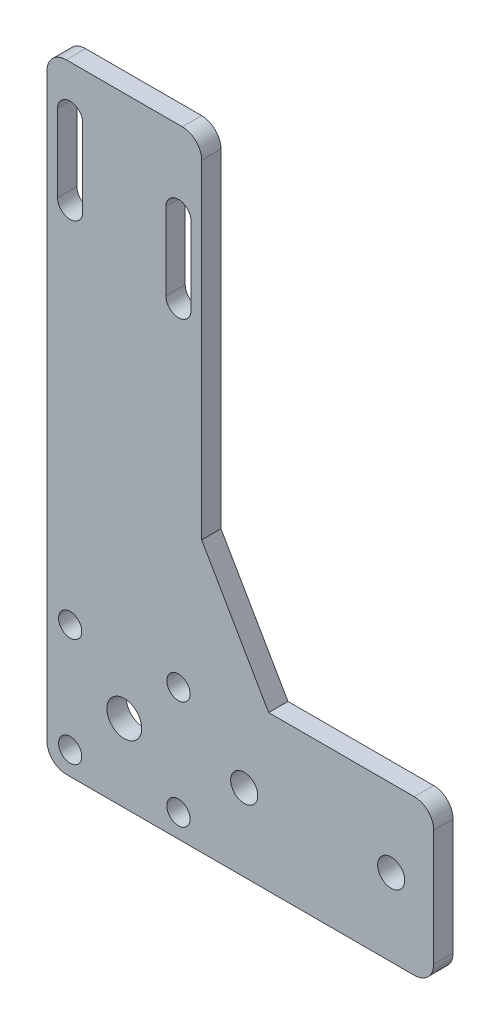
ISO-10303-21;
HEADER;
FILE_DESCRIPTION(('STEP AP214'),'2;1');
FILE_NAME('part.step','',(''),(''),'','','');
FILE_SCHEMA(('AUTOMOTIVE_DESIGN { 1 0 10303 214 1 1 1 1 }'));
ENDSEC;
DATA;
#1=APPLICATION_CONTEXT('core data for automotive mechanical design processes');
#2=APPLICATION_PROTOCOL_DEFINITION('international standard','automotive_design',2000,#1);
#3=PRODUCT_CONTEXT('',#1,'mechanical');
#4=PRODUCT('Part','Part','',(#3));
#5=PRODUCT_RELATED_PRODUCT_CATEGORY('part','',(#4));
#6=PRODUCT_DEFINITION_FORMATION('','',#4);
#7=PRODUCT_DEFINITION_CONTEXT('part definition',#1,'design');
#8=PRODUCT_DEFINITION('design','',#6,#7);
#9=PRODUCT_DEFINITION_SHAPE('','',#8);
#10=(LENGTH_UNIT() NAMED_UNIT(*) SI_UNIT(.MILLI.,.METRE.));
#11=(NAMED_UNIT(*) PLANE_ANGLE_UNIT() SI_UNIT($,.RADIAN.));
#12=(NAMED_UNIT(*) SI_UNIT($,.STERADIAN.) SOLID_ANGLE_UNIT());
#13=UNCERTAINTY_MEASURE_WITH_UNIT(LENGTH_MEASURE(1.E-05),#10,'distance_accuracy_value','');
#14=(GEOMETRIC_REPRESENTATION_CONTEXT(3) GLOBAL_UNCERTAINTY_ASSIGNED_CONTEXT((#13)) GLOBAL_UNIT_ASSIGNED_CONTEXT((#10,
#11,#12)) REPRESENTATION_CONTEXT('',''));
#15=CARTESIAN_POINT('',(0.,0.,0.));
#16=DIRECTION('',(0.,0.,1.));
#17=DIRECTION('',(1.,0.,0.));
#18=AXIS2_PLACEMENT_3D('',#15,#16,#17);
#19=CARTESIAN_POINT('',(40.,0.,5.));
#20=DIRECTION('',(-1.,0.,0.));
#21=DIRECTION('',(0.,0.,1.));
#22=AXIS2_PLACEMENT_3D('',#19,#20,#21);
#23=PLANE('',#22);
#24=DIRECTION('',(0.,1.,0.));
#25=VECTOR('',#24,1.);
#26=CARTESIAN_POINT('',(40.,0.,5.));
#27=LINE('',#26,#25);
#28=CARTESIAN_POINT('',(40.,69.9999999999998,5.));
#29=VERTEX_POINT('',#28);
#30=CARTESIAN_POINT('',(40.,155.,5.));
#31=VERTEX_POINT('',#30);
#32=EDGE_CURVE('E268',#29,#31,#27,.T.);
#33=ORIENTED_EDGE('',*,*,#32,.F.);
#34=DIRECTION('',(0.,0.,-1.));
#35=VECTOR('',#34,1.);
#36=CARTESIAN_POINT('',(40.,69.9999999999998,5.));
#37=LINE('',#36,#35);
#38=CARTESIAN_POINT('',(40.,69.9999999999998,0.));
#39=VERTEX_POINT('',#38);
#40=EDGE_CURVE('E54',#29,#39,#37,.T.);
#41=ORIENTED_EDGE('',*,*,#40,.T.);
#42=DIRECTION('',(0.,1.,0.));
#43=VECTOR('',#42,1.);
#44=CARTESIAN_POINT('',(40.,0.,0.));
#45=LINE('',#44,#43);
#46=CARTESIAN_POINT('',(40.,155.,0.));
#47=VERTEX_POINT('',#46);
#48=EDGE_CURVE('E279',#39,#47,#45,.T.);
#49=ORIENTED_EDGE('',*,*,#48,.T.);
#50=DIRECTION('',(0.,0.,-1.));
#51=VECTOR('',#50,1.);
#52=CARTESIAN_POINT('',(40.,155.,5.));
#53=LINE('',#52,#51);
#54=EDGE_CURVE('E340',#47,#31,#53,.F.);
#55=ORIENTED_EDGE('',*,*,#54,.T.);
#56=EDGE_LOOP('',(#33,#41,#49,#55));
#57=FACE_BOUND('',#56,.T.);
#58=ADVANCED_FACE('F33',(#57),#23,.F.);
#59=CARTESIAN_POINT('',(0.,0.,5.));
#60=DIRECTION('',(1.,0.,0.));
#61=DIRECTION('',(0.,0.,-1.));
#62=AXIS2_PLACEMENT_3D('',#59,#60,#61);
#63=PLANE('',#62);
#64=DIRECTION('',(0.,-1.,0.));
#65=VECTOR('',#64,1.);
#66=CARTESIAN_POINT('',(0.,0.,5.));
#67=LINE('',#66,#65);
#68=CARTESIAN_POINT('',(0.,155.,5.));
#69=VERTEX_POINT('',#68);
#70=CARTESIAN_POINT('',(0.,5.,5.));
#71=VERTEX_POINT('',#70);
#72=EDGE_CURVE('E261',#69,#71,#67,.T.);
#73=ORIENTED_EDGE('',*,*,#72,.F.);
#74=DIRECTION('',(0.,0.,-1.));
#75=VECTOR('',#74,1.);
#76=CARTESIAN_POINT('',(0.,155.,5.));
#77=LINE('',#76,#75);
#78=CARTESIAN_POINT('',(0.,155.,0.));
#79=VERTEX_POINT('',#78);
#80=EDGE_CURVE('E332',#69,#79,#77,.T.);
#81=ORIENTED_EDGE('',*,*,#80,.T.);
#82=DIRECTION('',(0.,-1.,0.));
#83=VECTOR('',#82,1.);
#84=CARTESIAN_POINT('',(0.,0.,0.));
#85=LINE('',#84,#83);
#86=CARTESIAN_POINT('',(0.,5.,0.));
#87=VERTEX_POINT('',#86);
#88=EDGE_CURVE('E260',#79,#87,#85,.T.);
#89=ORIENTED_EDGE('',*,*,#88,.T.);
#90=DIRECTION('',(0.,0.,-1.));
#91=VECTOR('',#90,1.);
#92=CARTESIAN_POINT('',(0.,5.,5.));
#93=LINE('',#92,#91);
#94=EDGE_CURVE('E330',#87,#71,#93,.F.);
#95=ORIENTED_EDGE('',*,*,#94,.T.);
#96=EDGE_LOOP('',(#73,#81,#89,#95));
#97=FACE_BOUND('',#96,.T.);
#98=ADVANCED_FACE('F407',(#97),#63,.F.);
#99=CARTESIAN_POINT('',(0.,0.,5.));
#100=DIRECTION('',(0.,1.,0.));
#101=DIRECTION('',(0.,0.,1.));
#102=AXIS2_PLACEMENT_3D('',#99,#100,#101);
#103=PLANE('',#102);
#104=DIRECTION('',(1.,0.,0.));
#105=VECTOR('',#104,1.);
#106=CARTESIAN_POINT('',(0.,0.,0.));
#107=LINE('',#106,#105);
#108=CARTESIAN_POINT('',(5.,0.,0.));
#109=VERTEX_POINT('',#108);
#110=CARTESIAN_POINT('',(95.,0.,0.));
#111=VERTEX_POINT('',#110);
#112=EDGE_CURVE('E276',#109,#111,#107,.T.);
#113=ORIENTED_EDGE('',*,*,#112,.T.);
#114=DIRECTION('',(0.,0.,1.));
#115=VECTOR('',#114,1.);
#116=CARTESIAN_POINT('',(95.,0.,5.));
#117=LINE('',#116,#115);
#118=CARTESIAN_POINT('',(95.,0.,5.));
#119=VERTEX_POINT('',#118);
#120=EDGE_CURVE('E327',#111,#119,#117,.T.);
#121=ORIENTED_EDGE('',*,*,#120,.T.);
#122=DIRECTION('',(1.,0.,0.));
#123=VECTOR('',#122,1.);
#124=CARTESIAN_POINT('',(0.,0.,5.));
#125=LINE('',#124,#123);
#126=CARTESIAN_POINT('',(5.,0.,5.));
#127=VERTEX_POINT('',#126);
#128=EDGE_CURVE('E264',#127,#119,#125,.T.);
#129=ORIENTED_EDGE('',*,*,#128,.F.);
#130=DIRECTION('',(0.,0.,-1.));
#131=VECTOR('',#130,1.);
#132=CARTESIAN_POINT('',(5.,0.,5.));
#133=LINE('',#132,#131);
#134=EDGE_CURVE('E324',#127,#109,#133,.T.);
#135=ORIENTED_EDGE('',*,*,#134,.T.);
#136=EDGE_LOOP('',(#113,#121,#129,#135));
#137=FACE_BOUND('',#136,.T.);
#138=ADVANCED_FACE('F412',(#137),#103,.F.);
#139=CARTESIAN_POINT('',(0.,160.,5.));
#140=DIRECTION('',(0.,-1.,0.));
#141=DIRECTION('',(0.,0.,-1.));
#142=AXIS2_PLACEMENT_3D('',#139,#140,#141);
#143=PLANE('',#142);
#144=DIRECTION('',(-1.,0.,0.));
#145=VECTOR('',#144,1.);
#146=CARTESIAN_POINT('',(0.,160.,0.));
#147=LINE('',#146,#145);
#148=CARTESIAN_POINT('',(35.,160.,0.));
#149=VERTEX_POINT('',#148);
#150=CARTESIAN_POINT('',(5.,160.,0.));
#151=VERTEX_POINT('',#150);
#152=EDGE_CURVE('E265',#149,#151,#147,.T.);
#153=ORIENTED_EDGE('',*,*,#152,.T.);
#154=DIRECTION('',(0.,0.,-1.));
#155=VECTOR('',#154,1.);
#156=CARTESIAN_POINT('',(5.,160.,5.));
#157=LINE('',#156,#155);
#158=CARTESIAN_POINT('',(5.,160.,5.));
#159=VERTEX_POINT('',#158);
#160=EDGE_CURVE('E338',#151,#159,#157,.F.);
#161=ORIENTED_EDGE('',*,*,#160,.T.);
#162=DIRECTION('',(-1.,0.,0.));
#163=VECTOR('',#162,1.);
#164=CARTESIAN_POINT('',(0.,160.,5.));
#165=LINE('',#164,#163);
#166=CARTESIAN_POINT('',(35.,160.,5.));
#167=VERTEX_POINT('',#166);
#168=EDGE_CURVE('E270',#167,#159,#165,.T.);
#169=ORIENTED_EDGE('',*,*,#168,.F.);
#170=DIRECTION('',(0.,0.,-1.));
#171=VECTOR('',#170,1.);
#172=CARTESIAN_POINT('',(35.,160.,5.));
#173=LINE('',#172,#171);
#174=EDGE_CURVE('E335',#167,#149,#173,.T.);
#175=ORIENTED_EDGE('',*,*,#174,.T.);
#176=EDGE_LOOP('',(#153,#161,#169,#175));
#177=FACE_BOUND('',#176,.T.);
#178=ADVANCED_FACE('F390',(#177),#143,.F.);
#179=CARTESIAN_POINT('',(0.,0.,5.));
#180=DIRECTION('',(0.,0.,-1.));
#181=DIRECTION('',(-1.,0.,0.));
#182=AXIS2_PLACEMENT_3D('',#179,#180,#181);
#183=PLANE('',#182);
#184=DIRECTION('',(0.,1.,0.));
#185=VECTOR('',#184,1.);
#186=CARTESIAN_POINT('',(37.25,120.,5.));
#187=LINE('',#186,#185);
#188=CARTESIAN_POINT('',(37.25,120.,5.));
#189=VERTEX_POINT('',#188);
#190=CARTESIAN_POINT('',(37.25,140.,5.));
#191=VERTEX_POINT('',#190);
#192=EDGE_CURVE('E289',#189,#191,#187,.T.);
#193=ORIENTED_EDGE('',*,*,#192,.F.);
#194=CARTESIAN_POINT('',(34.,120.,5.));
#195=DIRECTION('',(0.,0.,1.));
#196=DIRECTION('',(1.,0.,0.));
#197=AXIS2_PLACEMENT_3D('',#194,#195,#196);
#198=CIRCLE('',#197,3.25);
#199=CARTESIAN_POINT('',(30.75,120.,5.));
#200=VERTEX_POINT('',#199);
#201=EDGE_CURVE('E257',#200,#189,#198,.T.);
#202=ORIENTED_EDGE('',*,*,#201,.F.);
#203=DIRECTION('',(0.,-1.,0.));
#204=VECTOR('',#203,1.);
#205=CARTESIAN_POINT('',(30.75,120.,5.));
#206=LINE('',#205,#204);
#207=CARTESIAN_POINT('',(30.75,140.,5.));
#208=VERTEX_POINT('',#207);
#209=EDGE_CURVE('E293',#208,#200,#206,.T.);
#210=ORIENTED_EDGE('',*,*,#209,.F.);
#211=CARTESIAN_POINT('',(34.,140.,5.));
#212=DIRECTION('',(0.,0.,1.));
#213=DIRECTION('',(1.,0.,0.));
#214=AXIS2_PLACEMENT_3D('',#211,#212,#213);
#215=CIRCLE('',#214,3.25);
#216=EDGE_CURVE('E291',#191,#208,#215,.T.);
#217=ORIENTED_EDGE('',*,*,#216,.F.);
#218=EDGE_LOOP('',(#193,#202,#210,#217));
#219=FACE_BOUND('',#218,.T.);
#220=DIRECTION('',(0.,-1.,0.));
#221=VECTOR('',#220,1.);
#222=CARTESIAN_POINT('',(2.74999999999998,148.,5.));
#223=LINE('',#222,#221);
#224=CARTESIAN_POINT('',(2.74999999999998,148.,5.));
#225=VERTEX_POINT('',#224);
#226=CARTESIAN_POINT('',(2.74999999999998,128.,5.));
#227=VERTEX_POINT('',#226);
#228=EDGE_CURVE('E252',#225,#227,#223,.T.);
#229=ORIENTED_EDGE('',*,*,#228,.F.);
#230=CARTESIAN_POINT('',(5.99999999999998,148.,5.));
#231=DIRECTION('',(0.,0.,1.));
#232=DIRECTION('',(1.,0.,0.));
#233=AXIS2_PLACEMENT_3D('',#230,#231,#232);
#234=CIRCLE('',#233,3.25);
#235=CARTESIAN_POINT('',(9.24999999999998,148.,5.));
#236=VERTEX_POINT('',#235);
#237=EDGE_CURVE('E176',#236,#225,#234,.T.);
#238=ORIENTED_EDGE('',*,*,#237,.F.);
#239=DIRECTION('',(0.,1.,0.));
#240=VECTOR('',#239,1.);
#241=CARTESIAN_POINT('',(9.24999999999998,148.,5.));
#242=LINE('',#241,#240);
#243=CARTESIAN_POINT('',(9.24999999999999,128.,5.));
#244=VERTEX_POINT('',#243);
#245=EDGE_CURVE('E286',#244,#236,#242,.T.);
#246=ORIENTED_EDGE('',*,*,#245,.F.);
#247=CARTESIAN_POINT('',(5.99999999999999,128.,5.));
#248=DIRECTION('',(0.,0.,1.));
#249=DIRECTION('',(1.,0.,0.));
#250=AXIS2_PLACEMENT_3D('',#247,#248,#249);
#251=CIRCLE('',#250,3.25);
#252=EDGE_CURVE('E284',#227,#244,#251,.T.);
#253=ORIENTED_EDGE('',*,*,#252,.F.);
#254=EDGE_LOOP('',(#229,#238,#246,#253));
#255=FACE_BOUND('',#254,.T.);
#256=CARTESIAN_POINT('',(6.,34.,5.));
#257=DIRECTION('',(0.,0.,-1.));
#258=DIRECTION('',(-1.,0.,0.));
#259=AXIS2_PLACEMENT_3D('',#256,#257,#258);
#260=CIRCLE('',#259,3.);
#261=CARTESIAN_POINT('',(3.,34.,5.));
#262=VERTEX_POINT('',#261);
#263=EDGE_CURVE('E249',#262,#262,#260,.T.);
#264=ORIENTED_EDGE('',*,*,#263,.T.);
#265=EDGE_LOOP('',(#264));
#266=FACE_BOUND('',#265,.T.);
#267=CARTESIAN_POINT('',(34.,34.,5.));
#268=DIRECTION('',(0.,0.,-1.));
#269=DIRECTION('',(-1.,0.,0.));
#270=AXIS2_PLACEMENT_3D('',#267,#268,#269);
#271=CIRCLE('',#270,3.);
#272=CARTESIAN_POINT('',(31.,34.,5.));
#273=VERTEX_POINT('',#272);
#274=EDGE_CURVE('E246',#273,#273,#271,.T.);
#275=ORIENTED_EDGE('',*,*,#274,.T.);
#276=EDGE_LOOP('',(#275));
#277=FACE_BOUND('',#276,.T.);
#278=CARTESIAN_POINT('',(34.,6.00000000000001,5.));
#279=DIRECTION('',(0.,0.,-1.));
#280=DIRECTION('',(-1.,0.,0.));
#281=AXIS2_PLACEMENT_3D('',#278,#279,#280);
#282=CIRCLE('',#281,3.);
#283=CARTESIAN_POINT('',(31.,6.00000000000001,5.));
#284=VERTEX_POINT('',#283);
#285=EDGE_CURVE('E243',#284,#284,#282,.T.);
#286=ORIENTED_EDGE('',*,*,#285,.T.);
#287=EDGE_LOOP('',(#286));
#288=FACE_BOUND('',#287,.T.);
#289=CARTESIAN_POINT('',(6.,6.00000000000001,5.));
#290=DIRECTION('',(0.,0.,-1.));
#291=DIRECTION('',(-1.,0.,0.));
#292=AXIS2_PLACEMENT_3D('',#289,#290,#291);
#293=CIRCLE('',#292,3.);
#294=CARTESIAN_POINT('',(3.,6.00000000000001,5.));
#295=VERTEX_POINT('',#294);
#296=EDGE_CURVE('E234',#295,#295,#293,.T.);
#297=ORIENTED_EDGE('',*,*,#296,.T.);
#298=EDGE_LOOP('',(#297));
#299=FACE_BOUND('',#298,.T.);
#300=CARTESIAN_POINT('',(20.,20.,5.));
#301=DIRECTION('',(0.,0.,-1.));
#302=DIRECTION('',(-1.,0.,0.));
#303=AXIS2_PLACEMENT_3D('',#300,#301,#302);
#304=CIRCLE('',#303,4.5);
#305=CARTESIAN_POINT('',(15.5,20.,5.));
#306=VERTEX_POINT('',#305);
#307=EDGE_CURVE('E256',#306,#306,#304,.T.);
#308=ORIENTED_EDGE('',*,*,#307,.T.);
#309=EDGE_LOOP('',(#308));
#310=FACE_BOUND('',#309,.T.);
#311=DIRECTION('',(0.,1.,0.));
#312=VECTOR('',#311,1.);
#313=CARTESIAN_POINT('',(100.,0.,5.));
#314=LINE('',#313,#312);
#315=CARTESIAN_POINT('',(100.,5.,5.));
#316=VERTEX_POINT('',#315);
#317=CARTESIAN_POINT('',(100.,35.,5.));
#318=VERTEX_POINT('',#317);
#319=EDGE_CURVE('E360',#316,#318,#314,.T.);
#320=ORIENTED_EDGE('',*,*,#319,.T.);
#321=CARTESIAN_POINT('',(95.,35.,5.));
#322=DIRECTION('',(0.,0.,-1.));
#323=DIRECTION('',(-1.,0.,0.));
#324=AXIS2_PLACEMENT_3D('',#321,#322,#323);
#325=CIRCLE('',#324,5.);
#326=CARTESIAN_POINT('',(95.,40.,5.));
#327=VERTEX_POINT('',#326);
#328=EDGE_CURVE('E309',#318,#327,#325,.F.);
#329=ORIENTED_EDGE('',*,*,#328,.T.);
#330=DIRECTION('',(-1.,0.,0.));
#331=VECTOR('',#330,1.);
#332=CARTESIAN_POINT('',(40.,40.,5.));
#333=LINE('',#332,#331);
#334=CARTESIAN_POINT('',(57.3205080756888,40.,5.));
#335=VERTEX_POINT('',#334);
#336=EDGE_CURVE('E351',#327,#335,#333,.T.);
#337=ORIENTED_EDGE('',*,*,#336,.T.);
#338=DIRECTION('',(-0.500000000000004,0.866025403784436,0.));
#339=VECTOR('',#338,1.);
#340=CARTESIAN_POINT('',(60.3108891324553,34.8205080756891,5.));
#341=LINE('',#340,#339);
#342=EDGE_CURVE('E41',#335,#29,#341,.T.);
#343=ORIENTED_EDGE('',*,*,#342,.T.);
#344=ORIENTED_EDGE('',*,*,#32,.T.);
#345=CARTESIAN_POINT('',(35.,155.,5.));
#346=DIRECTION('',(0.,0.,-1.));
#347=DIRECTION('',(-1.,0.,0.));
#348=AXIS2_PLACEMENT_3D('',#345,#346,#347);
#349=CIRCLE('',#348,5.);
#350=EDGE_CURVE('E303',#31,#167,#349,.F.);
#351=ORIENTED_EDGE('',*,*,#350,.T.);
#352=ORIENTED_EDGE('',*,*,#168,.T.);
#353=CARTESIAN_POINT('',(5.,155.,5.));
#354=DIRECTION('',(0.,0.,-1.));
#355=DIRECTION('',(-1.,0.,0.));
#356=AXIS2_PLACEMENT_3D('',#353,#354,#355);
#357=CIRCLE('',#356,5.);
#358=EDGE_CURVE('E305',#159,#69,#357,.F.);
#359=ORIENTED_EDGE('',*,*,#358,.T.);
#360=ORIENTED_EDGE('',*,*,#72,.T.);
#361=CARTESIAN_POINT('',(5.,5.,5.));
#362=DIRECTION('',(0.,0.,-1.));
#363=DIRECTION('',(-1.,0.,0.));
#364=AXIS2_PLACEMENT_3D('',#361,#362,#363);
#365=CIRCLE('',#364,5.);
#366=EDGE_CURVE('E301',#71,#127,#365,.F.);
#367=ORIENTED_EDGE('',*,*,#366,.T.);
#368=ORIENTED_EDGE('',*,*,#128,.T.);
#369=CARTESIAN_POINT('',(95.,5.,5.));
#370=DIRECTION('',(0.,0.,-1.));
#371=DIRECTION('',(-1.,0.,0.));
#372=AXIS2_PLACEMENT_3D('',#369,#370,#371);
#373=CIRCLE('',#372,5.);
#374=EDGE_CURVE('E307',#119,#316,#373,.F.);
#375=ORIENTED_EDGE('',*,*,#374,.T.);
#376=EDGE_LOOP('',(#320,#329,#337,#343,#344,#351,#352,#359,#360,#367,#368,#375));
#377=FACE_BOUND('',#376,.T.);
#378=CARTESIAN_POINT('',(89.,20.,5.));
#379=DIRECTION('',(0.,0.,1.));
#380=DIRECTION('',(-1.,0.,0.));
#381=AXIS2_PLACEMENT_3D('',#378,#379,#380);
#382=CIRCLE('',#381,3.50000000000001);
#383=CARTESIAN_POINT('',(85.5,20.,5.));
#384=VERTEX_POINT('',#383);
#385=EDGE_CURVE('E373',#384,#384,#382,.T.);
#386=ORIENTED_EDGE('',*,*,#385,.F.);
#387=EDGE_LOOP('',(#386));
#388=FACE_BOUND('',#387,.T.);
#389=CARTESIAN_POINT('',(51.,20.,5.));
#390=DIRECTION('',(0.,0.,1.));
#391=DIRECTION('',(1.,0.,0.));
#392=AXIS2_PLACEMENT_3D('',#389,#390,#391);
#393=CIRCLE('',#392,3.5);
#394=CARTESIAN_POINT('',(54.5,20.,5.));
#395=VERTEX_POINT('',#394);
#396=EDGE_CURVE('E367',#395,#395,#393,.T.);
#397=ORIENTED_EDGE('',*,*,#396,.F.);
#398=EDGE_LOOP('',(#397));
#399=FACE_BOUND('',#398,.T.);
#400=ADVANCED_FACE('F357',(#219,#255,#266,#277,#288,#299,#310,#377,#388,#399),#183,.F.);
#401=CARTESIAN_POINT('',(0.,0.,0.));
#402=DIRECTION('',(0.,0.,-1.));
#403=DIRECTION('',(-1.,0.,0.));
#404=AXIS2_PLACEMENT_3D('',#401,#402,#403);
#405=PLANE('',#404);
#406=CARTESIAN_POINT('',(34.,120.,0.));
#407=DIRECTION('',(0.,0.,1.));
#408=DIRECTION('',(1.,0.,0.));
#409=AXIS2_PLACEMENT_3D('',#406,#407,#408);
#410=CIRCLE('',#409,3.25);
#411=CARTESIAN_POINT('',(30.75,120.,0.));
#412=VERTEX_POINT('',#411);
#413=CARTESIAN_POINT('',(37.25,120.,0.));
#414=VERTEX_POINT('',#413);
#415=EDGE_CURVE('E211',#412,#414,#410,.T.);
#416=ORIENTED_EDGE('',*,*,#415,.T.);
#417=DIRECTION('',(0.,1.,0.));
#418=VECTOR('',#417,1.);
#419=CARTESIAN_POINT('',(37.25,120.,0.));
#420=LINE('',#419,#418);
#421=CARTESIAN_POINT('',(37.25,140.,0.));
#422=VERTEX_POINT('',#421);
#423=EDGE_CURVE('E214',#414,#422,#420,.T.);
#424=ORIENTED_EDGE('',*,*,#423,.T.);
#425=CARTESIAN_POINT('',(34.,140.,0.));
#426=DIRECTION('',(0.,0.,1.));
#427=DIRECTION('',(1.,0.,0.));
#428=AXIS2_PLACEMENT_3D('',#425,#426,#427);
#429=CIRCLE('',#428,3.25);
#430=CARTESIAN_POINT('',(30.75,140.,0.));
#431=VERTEX_POINT('',#430);
#432=EDGE_CURVE('E218',#422,#431,#429,.T.);
#433=ORIENTED_EDGE('',*,*,#432,.T.);
#434=DIRECTION('',(0.,-1.,0.));
#435=VECTOR('',#434,1.);
#436=CARTESIAN_POINT('',(30.75,120.,0.));
#437=LINE('',#436,#435);
#438=EDGE_CURVE('E221',#431,#412,#437,.T.);
#439=ORIENTED_EDGE('',*,*,#438,.T.);
#440=EDGE_LOOP('',(#416,#424,#433,#439));
#441=FACE_BOUND('',#440,.T.);
#442=CARTESIAN_POINT('',(5.99999999999998,148.,0.));
#443=DIRECTION('',(0.,0.,1.));
#444=DIRECTION('',(1.,0.,0.));
#445=AXIS2_PLACEMENT_3D('',#442,#443,#444);
#446=CIRCLE('',#445,3.25);
#447=CARTESIAN_POINT('',(9.24999999999998,148.,0.));
#448=VERTEX_POINT('',#447);
#449=CARTESIAN_POINT('',(2.74999999999998,148.,0.));
#450=VERTEX_POINT('',#449);
#451=EDGE_CURVE('E173',#448,#450,#446,.T.);
#452=ORIENTED_EDGE('',*,*,#451,.T.);
#453=DIRECTION('',(0.,-1.,0.));
#454=VECTOR('',#453,1.);
#455=CARTESIAN_POINT('',(2.74999999999998,148.,0.));
#456=LINE('',#455,#454);
#457=CARTESIAN_POINT('',(2.74999999999998,128.,0.));
#458=VERTEX_POINT('',#457);
#459=EDGE_CURVE('E184',#450,#458,#456,.T.);
#460=ORIENTED_EDGE('',*,*,#459,.T.);
#461=CARTESIAN_POINT('',(5.99999999999999,128.,0.));
#462=DIRECTION('',(0.,0.,1.));
#463=DIRECTION('',(1.,0.,0.));
#464=AXIS2_PLACEMENT_3D('',#461,#462,#463);
#465=CIRCLE('',#464,3.25);
#466=CARTESIAN_POINT('',(9.24999999999999,128.,0.));
#467=VERTEX_POINT('',#466);
#468=EDGE_CURVE('E189',#458,#467,#465,.T.);
#469=ORIENTED_EDGE('',*,*,#468,.T.);
#470=DIRECTION('',(0.,1.,0.));
#471=VECTOR('',#470,1.);
#472=CARTESIAN_POINT('',(9.24999999999998,148.,0.));
#473=LINE('',#472,#471);
#474=EDGE_CURVE('E180',#467,#448,#473,.T.);
#475=ORIENTED_EDGE('',*,*,#474,.T.);
#476=EDGE_LOOP('',(#452,#460,#469,#475));
#477=FACE_BOUND('',#476,.T.);
#478=CARTESIAN_POINT('',(6.,34.,0.));
#479=DIRECTION('',(0.,0.,1.));
#480=DIRECTION('',(-1.,0.,0.));
#481=AXIS2_PLACEMENT_3D('',#478,#479,#480);
#482=CIRCLE('',#481,3.);
#483=CARTESIAN_POINT('',(3.,34.,0.));
#484=VERTEX_POINT('',#483);
#485=EDGE_CURVE('E200',#484,#484,#482,.T.);
#486=ORIENTED_EDGE('',*,*,#485,.T.);
#487=EDGE_LOOP('',(#486));
#488=FACE_BOUND('',#487,.T.);
#489=CARTESIAN_POINT('',(34.,34.,0.));
#490=DIRECTION('',(0.,0.,1.));
#491=DIRECTION('',(1.,0.,0.));
#492=AXIS2_PLACEMENT_3D('',#489,#490,#491);
#493=CIRCLE('',#492,3.);
#494=CARTESIAN_POINT('',(37.,34.,0.));
#495=VERTEX_POINT('',#494);
#496=EDGE_CURVE('E238',#495,#495,#493,.T.);
#497=ORIENTED_EDGE('',*,*,#496,.T.);
#498=EDGE_LOOP('',(#497));
#499=FACE_BOUND('',#498,.T.);
#500=CARTESIAN_POINT('',(34.,6.00000000000001,0.));
#501=DIRECTION('',(0.,0.,1.));
#502=DIRECTION('',(-1.,0.,0.));
#503=AXIS2_PLACEMENT_3D('',#500,#501,#502);
#504=CIRCLE('',#503,3.);
#505=CARTESIAN_POINT('',(31.,6.00000000000001,0.));
#506=VERTEX_POINT('',#505);
#507=EDGE_CURVE('E235',#506,#506,#504,.T.);
#508=ORIENTED_EDGE('',*,*,#507,.T.);
#509=EDGE_LOOP('',(#508));
#510=FACE_BOUND('',#509,.T.);
#511=CARTESIAN_POINT('',(6.,6.00000000000001,0.));
#512=DIRECTION('',(0.,0.,1.));
#513=DIRECTION('',(1.,0.,0.));
#514=AXIS2_PLACEMENT_3D('',#511,#512,#513);
#515=CIRCLE('',#514,3.);
#516=CARTESIAN_POINT('',(9.,6.00000000000001,0.));
#517=VERTEX_POINT('',#516);
#518=EDGE_CURVE('E231',#517,#517,#515,.T.);
#519=ORIENTED_EDGE('',*,*,#518,.T.);
#520=EDGE_LOOP('',(#519));
#521=FACE_BOUND('',#520,.T.);
#522=CARTESIAN_POINT('',(20.,20.,0.));
#523=DIRECTION('',(0.,0.,1.));
#524=DIRECTION('',(1.,0.,0.));
#525=AXIS2_PLACEMENT_3D('',#522,#523,#524);
#526=CIRCLE('',#525,4.5);
#527=CARTESIAN_POINT('',(24.5,20.,0.));
#528=VERTEX_POINT('',#527);
#529=EDGE_CURVE('E253',#528,#528,#526,.T.);
#530=ORIENTED_EDGE('',*,*,#529,.T.);
#531=EDGE_LOOP('',(#530));
#532=FACE_BOUND('',#531,.T.);
#533=DIRECTION('',(-1.,0.,0.));
#534=VECTOR('',#533,1.);
#535=CARTESIAN_POINT('',(40.,40.,0.));
#536=LINE('',#535,#534);
#537=CARTESIAN_POINT('',(95.,40.,0.));
#538=VERTEX_POINT('',#537);
#539=CARTESIAN_POINT('',(57.3205080756888,40.,0.));
#540=VERTEX_POINT('',#539);
#541=EDGE_CURVE('E215',#538,#540,#536,.T.);
#542=ORIENTED_EDGE('',*,*,#541,.F.);
#543=CARTESIAN_POINT('',(95.,35.,0.));
#544=DIRECTION('',(0.,0.,-1.));
#545=DIRECTION('',(-1.,0.,0.));
#546=AXIS2_PLACEMENT_3D('',#543,#544,#545);
#547=CIRCLE('',#546,5.);
#548=CARTESIAN_POINT('',(100.,35.,0.));
#549=VERTEX_POINT('',#548);
#550=EDGE_CURVE('E322',#538,#549,#547,.T.);
#551=ORIENTED_EDGE('',*,*,#550,.T.);
#552=DIRECTION('',(0.,1.,0.));
#553=VECTOR('',#552,1.);
#554=CARTESIAN_POINT('',(100.,0.,0.));
#555=LINE('',#554,#553);
#556=CARTESIAN_POINT('',(100.,5.,0.));
#557=VERTEX_POINT('',#556);
#558=EDGE_CURVE('E359',#557,#549,#555,.T.);
#559=ORIENTED_EDGE('',*,*,#558,.F.);
#560=CARTESIAN_POINT('',(95.,5.,0.));
#561=DIRECTION('',(0.,0.,-1.));
#562=DIRECTION('',(-1.,0.,0.));
#563=AXIS2_PLACEMENT_3D('',#560,#561,#562);
#564=CIRCLE('',#563,5.);
#565=EDGE_CURVE('E320',#557,#111,#564,.T.);
#566=ORIENTED_EDGE('',*,*,#565,.T.);
#567=ORIENTED_EDGE('',*,*,#112,.F.);
#568=CARTESIAN_POINT('',(5.,5.,0.));
#569=DIRECTION('',(0.,0.,-1.));
#570=DIRECTION('',(-1.,0.,0.));
#571=AXIS2_PLACEMENT_3D('',#568,#569,#570);
#572=CIRCLE('',#571,5.);
#573=EDGE_CURVE('E313',#109,#87,#572,.T.);
#574=ORIENTED_EDGE('',*,*,#573,.T.);
#575=ORIENTED_EDGE('',*,*,#88,.F.);
#576=CARTESIAN_POINT('',(5.,155.,0.));
#577=DIRECTION('',(0.,0.,-1.));
#578=DIRECTION('',(-1.,0.,0.));
#579=AXIS2_PLACEMENT_3D('',#576,#577,#578);
#580=CIRCLE('',#579,5.);
#581=EDGE_CURVE('E318',#79,#151,#580,.T.);
#582=ORIENTED_EDGE('',*,*,#581,.T.);
#583=ORIENTED_EDGE('',*,*,#152,.F.);
#584=CARTESIAN_POINT('',(35.,155.,0.));
#585=DIRECTION('',(0.,0.,-1.));
#586=DIRECTION('',(-1.,0.,0.));
#587=AXIS2_PLACEMENT_3D('',#584,#585,#586);
#588=CIRCLE('',#587,5.);
#589=EDGE_CURVE('E315',#149,#47,#588,.T.);
#590=ORIENTED_EDGE('',*,*,#589,.T.);
#591=ORIENTED_EDGE('',*,*,#48,.F.);
#592=DIRECTION('',(0.500000000000004,-0.866025403784436,0.));
#593=VECTOR('',#592,1.);
#594=CARTESIAN_POINT('',(57.3205080756889,40.,0.));
#595=LINE('',#594,#593);
#596=EDGE_CURVE('E11',#39,#540,#595,.T.);
#597=ORIENTED_EDGE('',*,*,#596,.T.);
#598=EDGE_LOOP('',(#542,#551,#559,#566,#567,#574,#575,#582,#583,#590,#591,#597));
#599=FACE_BOUND('',#598,.T.);
#600=CARTESIAN_POINT('',(89.,20.,0.));
#601=DIRECTION('',(0.,0.,1.));
#602=DIRECTION('',(-1.,0.,0.));
#603=AXIS2_PLACEMENT_3D('',#600,#601,#602);
#604=CIRCLE('',#603,3.50000000000001);
#605=CARTESIAN_POINT('',(85.5,20.,0.));
#606=VERTEX_POINT('',#605);
#607=EDGE_CURVE('E370',#606,#606,#604,.T.);
#608=ORIENTED_EDGE('',*,*,#607,.T.);
#609=EDGE_LOOP('',(#608));
#610=FACE_BOUND('',#609,.T.);
#611=CARTESIAN_POINT('',(51.,20.,0.));
#612=DIRECTION('',(0.,0.,1.));
#613=DIRECTION('',(1.,0.,0.));
#614=AXIS2_PLACEMENT_3D('',#611,#612,#613);
#615=CIRCLE('',#614,3.5);
#616=CARTESIAN_POINT('',(54.5,20.,0.));
#617=VERTEX_POINT('',#616);
#618=EDGE_CURVE('E363',#617,#617,#615,.T.);
#619=ORIENTED_EDGE('',*,*,#618,.T.);
#620=EDGE_LOOP('',(#619));
#621=FACE_BOUND('',#620,.T.);
#622=ADVANCED_FACE('F191',(#441,#477,#488,#499,#510,#521,#532,#599,#610,#621),#405,.T.);
#623=CARTESIAN_POINT('',(20.,20.,0.));
#624=DIRECTION('',(0.,0.,1.));
#625=DIRECTION('',(1.,0.,0.));
#626=AXIS2_PLACEMENT_3D('',#623,#624,#625);
#627=CYLINDRICAL_SURFACE('',#626,4.5);
#628=ORIENTED_EDGE('',*,*,#529,.F.);
#629=EDGE_LOOP('',(#628));
#630=FACE_BOUND('',#629,.T.);
#631=ORIENTED_EDGE('',*,*,#307,.F.);
#632=EDGE_LOOP('',(#631));
#633=FACE_BOUND('',#632,.T.);
#634=ADVANCED_FACE('F481',(#630,#633),#627,.F.);
#635=CARTESIAN_POINT('',(6.,6.00000000000001,0.));
#636=DIRECTION('',(0.,0.,1.));
#637=DIRECTION('',(1.,0.,0.));
#638=AXIS2_PLACEMENT_3D('',#635,#636,#637);
#639=CYLINDRICAL_SURFACE('',#638,3.);
#640=ORIENTED_EDGE('',*,*,#518,.F.);
#641=EDGE_LOOP('',(#640));
#642=FACE_BOUND('',#641,.T.);
#643=ORIENTED_EDGE('',*,*,#296,.F.);
#644=EDGE_LOOP('',(#643));
#645=FACE_BOUND('',#644,.T.);
#646=ADVANCED_FACE('F489',(#642,#645),#639,.F.);
#647=CARTESIAN_POINT('',(34.,6.00000000000001,0.));
#648=DIRECTION('',(0.,0.,1.));
#649=DIRECTION('',(1.,0.,0.));
#650=AXIS2_PLACEMENT_3D('',#647,#648,#649);
#651=CYLINDRICAL_SURFACE('',#650,3.);
#652=ORIENTED_EDGE('',*,*,#507,.F.);
#653=EDGE_LOOP('',(#652));
#654=FACE_BOUND('',#653,.T.);
#655=ORIENTED_EDGE('',*,*,#285,.F.);
#656=EDGE_LOOP('',(#655));
#657=FACE_BOUND('',#656,.T.);
#658=ADVANCED_FACE('F497',(#654,#657),#651,.F.);
#659=CARTESIAN_POINT('',(34.,34.,0.));
#660=DIRECTION('',(0.,0.,1.));
#661=DIRECTION('',(1.,0.,0.));
#662=AXIS2_PLACEMENT_3D('',#659,#660,#661);
#663=CYLINDRICAL_SURFACE('',#662,3.);
#664=ORIENTED_EDGE('',*,*,#496,.F.);
#665=EDGE_LOOP('',(#664));
#666=FACE_BOUND('',#665,.T.);
#667=ORIENTED_EDGE('',*,*,#274,.F.);
#668=EDGE_LOOP('',(#667));
#669=FACE_BOUND('',#668,.T.);
#670=ADVANCED_FACE('F505',(#666,#669),#663,.F.);
#671=CARTESIAN_POINT('',(6.,34.,0.));
#672=DIRECTION('',(0.,0.,1.));
#673=DIRECTION('',(1.,0.,0.));
#674=AXIS2_PLACEMENT_3D('',#671,#672,#673);
#675=CYLINDRICAL_SURFACE('',#674,3.);
#676=ORIENTED_EDGE('',*,*,#485,.F.);
#677=EDGE_LOOP('',(#676));
#678=FACE_BOUND('',#677,.T.);
#679=ORIENTED_EDGE('',*,*,#263,.F.);
#680=EDGE_LOOP('',(#679));
#681=FACE_BOUND('',#680,.T.);
#682=ADVANCED_FACE('F513',(#678,#681),#675,.F.);
#683=CARTESIAN_POINT('',(5.99999999999998,148.,0.));
#684=DIRECTION('',(0.,0.,1.));
#685=DIRECTION('',(1.,0.,0.));
#686=AXIS2_PLACEMENT_3D('',#683,#684,#685);
#687=CYLINDRICAL_SURFACE('',#686,3.25);
#688=DIRECTION('',(0.,0.,1.));
#689=VECTOR('',#688,1.);
#690=CARTESIAN_POINT('',(2.74999999999998,148.,0.));
#691=LINE('',#690,#689);
#692=EDGE_CURVE('E168',#450,#225,#691,.T.);
#693=ORIENTED_EDGE('',*,*,#692,.F.);
#694=ORIENTED_EDGE('',*,*,#451,.F.);
#695=DIRECTION('',(0.,0.,1.));
#696=VECTOR('',#695,1.);
#697=CARTESIAN_POINT('',(9.24999999999998,148.,0.));
#698=LINE('',#697,#696);
#699=EDGE_CURVE('E208',#448,#236,#698,.T.);
#700=ORIENTED_EDGE('',*,*,#699,.T.);
#701=ORIENTED_EDGE('',*,*,#237,.T.);
#702=EDGE_LOOP('',(#693,#694,#700,#701));
#703=FACE_BOUND('',#702,.T.);
#704=ADVANCED_FACE('F170',(#703),#687,.F.);
#705=CARTESIAN_POINT('',(9.24999999999998,148.,0.));
#706=DIRECTION('',(1.,0.,0.));
#707=DIRECTION('',(0.,1.,0.));
#708=AXIS2_PLACEMENT_3D('',#705,#706,#707);
#709=PLANE('',#708);
#710=ORIENTED_EDGE('',*,*,#699,.F.);
#711=ORIENTED_EDGE('',*,*,#474,.F.);
#712=DIRECTION('',(0.,0.,1.));
#713=VECTOR('',#712,1.);
#714=CARTESIAN_POINT('',(9.24999999999999,128.,0.));
#715=LINE('',#714,#713);
#716=EDGE_CURVE('E205',#467,#244,#715,.T.);
#717=ORIENTED_EDGE('',*,*,#716,.T.);
#718=ORIENTED_EDGE('',*,*,#245,.T.);
#719=EDGE_LOOP('',(#710,#711,#717,#718));
#720=FACE_BOUND('',#719,.T.);
#721=ADVANCED_FACE('F528',(#720),#709,.F.);
#722=CARTESIAN_POINT('',(5.99999999999999,128.,0.));
#723=DIRECTION('',(0.,0.,1.));
#724=DIRECTION('',(1.,0.,0.));
#725=AXIS2_PLACEMENT_3D('',#722,#723,#724);
#726=CYLINDRICAL_SURFACE('',#725,3.25);
#727=ORIENTED_EDGE('',*,*,#716,.F.);
#728=ORIENTED_EDGE('',*,*,#468,.F.);
#729=DIRECTION('',(0.,0.,1.));
#730=VECTOR('',#729,1.);
#731=CARTESIAN_POINT('',(2.74999999999998,128.,0.));
#732=LINE('',#731,#730);
#733=EDGE_CURVE('E179',#458,#227,#732,.T.);
#734=ORIENTED_EDGE('',*,*,#733,.T.);
#735=ORIENTED_EDGE('',*,*,#252,.T.);
#736=EDGE_LOOP('',(#727,#728,#734,#735));
#737=FACE_BOUND('',#736,.T.);
#738=ADVANCED_FACE('F535',(#737),#726,.F.);
#739=CARTESIAN_POINT('',(2.74999999999998,148.,0.));
#740=DIRECTION('',(-1.,0.,0.));
#741=DIRECTION('',(0.,-1.,0.));
#742=AXIS2_PLACEMENT_3D('',#739,#740,#741);
#743=PLANE('',#742);
#744=ORIENTED_EDGE('',*,*,#733,.F.);
#745=ORIENTED_EDGE('',*,*,#459,.F.);
#746=ORIENTED_EDGE('',*,*,#692,.T.);
#747=ORIENTED_EDGE('',*,*,#228,.T.);
#748=EDGE_LOOP('',(#744,#745,#746,#747));
#749=FACE_BOUND('',#748,.T.);
#750=ADVANCED_FACE('F185',(#749),#743,.F.);
#751=CARTESIAN_POINT('',(34.,120.,0.));
#752=DIRECTION('',(0.,0.,1.));
#753=DIRECTION('',(1.,0.,0.));
#754=AXIS2_PLACEMENT_3D('',#751,#752,#753);
#755=CYLINDRICAL_SURFACE('',#754,3.25);
#756=DIRECTION('',(0.,0.,1.));
#757=VECTOR('',#756,1.);
#758=CARTESIAN_POINT('',(37.25,120.,0.));
#759=LINE('',#758,#757);
#760=EDGE_CURVE('E224',#414,#189,#759,.T.);
#761=ORIENTED_EDGE('',*,*,#760,.F.);
#762=ORIENTED_EDGE('',*,*,#415,.F.);
#763=DIRECTION('',(0.,0.,1.));
#764=VECTOR('',#763,1.);
#765=CARTESIAN_POINT('',(30.75,120.,0.));
#766=LINE('',#765,#764);
#767=EDGE_CURVE('E194',#412,#200,#766,.T.);
#768=ORIENTED_EDGE('',*,*,#767,.T.);
#769=ORIENTED_EDGE('',*,*,#201,.T.);
#770=EDGE_LOOP('',(#761,#762,#768,#769));
#771=FACE_BOUND('',#770,.T.);
#772=ADVANCED_FACE('F550',(#771),#755,.F.);
#773=CARTESIAN_POINT('',(30.75,120.,0.));
#774=DIRECTION('',(-1.,0.,0.));
#775=DIRECTION('',(0.,-1.,0.));
#776=AXIS2_PLACEMENT_3D('',#773,#774,#775);
#777=PLANE('',#776);
#778=ORIENTED_EDGE('',*,*,#767,.F.);
#779=ORIENTED_EDGE('',*,*,#438,.F.);
#780=DIRECTION('',(0.,0.,1.));
#781=VECTOR('',#780,1.);
#782=CARTESIAN_POINT('',(30.75,140.,0.));
#783=LINE('',#782,#781);
#784=EDGE_CURVE('E197',#431,#208,#783,.T.);
#785=ORIENTED_EDGE('',*,*,#784,.T.);
#786=ORIENTED_EDGE('',*,*,#209,.T.);
#787=EDGE_LOOP('',(#778,#779,#785,#786));
#788=FACE_BOUND('',#787,.T.);
#789=ADVANCED_FACE('F557',(#788),#777,.F.);
#790=CARTESIAN_POINT('',(34.,140.,0.));
#791=DIRECTION('',(0.,0.,1.));
#792=DIRECTION('',(1.,0.,0.));
#793=AXIS2_PLACEMENT_3D('',#790,#791,#792);
#794=CYLINDRICAL_SURFACE('',#793,3.25);
#795=ORIENTED_EDGE('',*,*,#784,.F.);
#796=ORIENTED_EDGE('',*,*,#432,.F.);
#797=DIRECTION('',(0.,0.,1.));
#798=VECTOR('',#797,1.);
#799=CARTESIAN_POINT('',(37.25,140.,0.));
#800=LINE('',#799,#798);
#801=EDGE_CURVE('E226',#422,#191,#800,.T.);
#802=ORIENTED_EDGE('',*,*,#801,.T.);
#803=ORIENTED_EDGE('',*,*,#216,.T.);
#804=EDGE_LOOP('',(#795,#796,#802,#803));
#805=FACE_BOUND('',#804,.T.);
#806=ADVANCED_FACE('F565',(#805),#794,.F.);
#807=CARTESIAN_POINT('',(37.25,120.,0.));
#808=DIRECTION('',(1.,0.,0.));
#809=DIRECTION('',(0.,1.,0.));
#810=AXIS2_PLACEMENT_3D('',#807,#808,#809);
#811=PLANE('',#810);
#812=ORIENTED_EDGE('',*,*,#801,.F.);
#813=ORIENTED_EDGE('',*,*,#423,.F.);
#814=ORIENTED_EDGE('',*,*,#760,.T.);
#815=ORIENTED_EDGE('',*,*,#192,.T.);
#816=EDGE_LOOP('',(#812,#813,#814,#815));
#817=FACE_BOUND('',#816,.T.);
#818=ADVANCED_FACE('F573',(#817),#811,.F.);
#819=CARTESIAN_POINT('',(40.,40.,0.));
#820=DIRECTION('',(0.,1.,0.));
#821=DIRECTION('',(0.,0.,1.));
#822=AXIS2_PLACEMENT_3D('',#819,#820,#821);
#823=PLANE('',#822);
#824=ORIENTED_EDGE('',*,*,#541,.T.);
#825=DIRECTION('',(0.,0.,1.));
#826=VECTOR('',#825,1.);
#827=CARTESIAN_POINT('',(57.3205080756889,40.,0.));
#828=LINE('',#827,#826);
#829=EDGE_CURVE('E343',#540,#335,#828,.T.);
#830=ORIENTED_EDGE('',*,*,#829,.T.);
#831=ORIENTED_EDGE('',*,*,#336,.F.);
#832=DIRECTION('',(0.,0.,1.));
#833=VECTOR('',#832,1.);
#834=CARTESIAN_POINT('',(95.,40.,0.));
#835=LINE('',#834,#833);
#836=EDGE_CURVE('E311',#327,#538,#835,.F.);
#837=ORIENTED_EDGE('',*,*,#836,.T.);
#838=EDGE_LOOP('',(#824,#830,#831,#837));
#839=FACE_BOUND('',#838,.T.);
#840=ADVANCED_FACE('F350',(#839),#823,.T.);
#841=CARTESIAN_POINT('',(100.,0.,0.));
#842=DIRECTION('',(1.,0.,0.));
#843=DIRECTION('',(0.,0.,-1.));
#844=AXIS2_PLACEMENT_3D('',#841,#842,#843);
#845=PLANE('',#844);
#846=ORIENTED_EDGE('',*,*,#558,.T.);
#847=DIRECTION('',(0.,0.,1.));
#848=VECTOR('',#847,1.);
#849=CARTESIAN_POINT('',(100.,35.,0.));
#850=LINE('',#849,#848);
#851=EDGE_CURVE('E298',#549,#318,#850,.T.);
#852=ORIENTED_EDGE('',*,*,#851,.T.);
#853=ORIENTED_EDGE('',*,*,#319,.F.);
#854=DIRECTION('',(0.,0.,1.));
#855=VECTOR('',#854,1.);
#856=CARTESIAN_POINT('',(100.,5.,0.));
#857=LINE('',#856,#855);
#858=EDGE_CURVE('E273',#316,#557,#857,.F.);
#859=ORIENTED_EDGE('',*,*,#858,.T.);
#860=EDGE_LOOP('',(#846,#852,#853,#859));
#861=FACE_BOUND('',#860,.T.);
#862=ADVANCED_FACE('F396',(#861),#845,.T.);
#863=CARTESIAN_POINT('',(51.,20.,0.));
#864=DIRECTION('',(0.,0.,1.));
#865=DIRECTION('',(1.,0.,0.));
#866=AXIS2_PLACEMENT_3D('',#863,#864,#865);
#867=CYLINDRICAL_SURFACE('',#866,3.5);
#868=ORIENTED_EDGE('',*,*,#618,.F.);
#869=EDGE_LOOP('',(#868));
#870=FACE_BOUND('',#869,.T.);
#871=ORIENTED_EDGE('',*,*,#396,.T.);
#872=EDGE_LOOP('',(#871));
#873=FACE_BOUND('',#872,.T.);
#874=ADVANCED_FACE('F385',(#870,#873),#867,.F.);
#875=CARTESIAN_POINT('',(89.,20.,0.));
#876=DIRECTION('',(0.,0.,1.));
#877=DIRECTION('',(1.,0.,0.));
#878=AXIS2_PLACEMENT_3D('',#875,#876,#877);
#879=CYLINDRICAL_SURFACE('',#878,3.50000000000001);
#880=ORIENTED_EDGE('',*,*,#607,.F.);
#881=EDGE_LOOP('',(#880));
#882=FACE_BOUND('',#881,.T.);
#883=ORIENTED_EDGE('',*,*,#385,.T.);
#884=EDGE_LOOP('',(#883));
#885=FACE_BOUND('',#884,.T.);
#886=ADVANCED_FACE('F381',(#882,#885),#879,.F.);
#887=CARTESIAN_POINT('',(95.,35.,0.));
#888=DIRECTION('',(0.,0.,1.));
#889=DIRECTION('',(1.,0.,0.));
#890=AXIS2_PLACEMENT_3D('',#887,#888,#889);
#891=CYLINDRICAL_SURFACE('',#890,5.);
#892=ORIENTED_EDGE('',*,*,#550,.F.);
#893=ORIENTED_EDGE('',*,*,#836,.F.);
#894=ORIENTED_EDGE('',*,*,#328,.F.);
#895=ORIENTED_EDGE('',*,*,#851,.F.);
#896=EDGE_LOOP('',(#892,#893,#894,#895));
#897=FACE_BOUND('',#896,.T.);
#898=ADVANCED_FACE('F384',(#897),#891,.T.);
#899=CARTESIAN_POINT('',(95.,5.,5.));
#900=DIRECTION('',(0.,0.,-1.));
#901=DIRECTION('',(-1.,0.,0.));
#902=AXIS2_PLACEMENT_3D('',#899,#900,#901);
#903=CYLINDRICAL_SURFACE('',#902,5.);
#904=ORIENTED_EDGE('',*,*,#565,.F.);
#905=ORIENTED_EDGE('',*,*,#858,.F.);
#906=ORIENTED_EDGE('',*,*,#374,.F.);
#907=ORIENTED_EDGE('',*,*,#120,.F.);
#908=EDGE_LOOP('',(#904,#905,#906,#907));
#909=FACE_BOUND('',#908,.T.);
#910=ADVANCED_FACE('F423',(#909),#903,.T.);
#911=CARTESIAN_POINT('',(5.,155.,5.));
#912=DIRECTION('',(0.,0.,-1.));
#913=DIRECTION('',(-1.,0.,0.));
#914=AXIS2_PLACEMENT_3D('',#911,#912,#913);
#915=CYLINDRICAL_SURFACE('',#914,5.);
#916=ORIENTED_EDGE('',*,*,#358,.F.);
#917=ORIENTED_EDGE('',*,*,#160,.F.);
#918=ORIENTED_EDGE('',*,*,#581,.F.);
#919=ORIENTED_EDGE('',*,*,#80,.F.);
#920=EDGE_LOOP('',(#916,#917,#918,#919));
#921=FACE_BOUND('',#920,.T.);
#922=ADVANCED_FACE('F427',(#921),#915,.T.);
#923=CARTESIAN_POINT('',(35.,155.,5.));
#924=DIRECTION('',(0.,0.,-1.));
#925=DIRECTION('',(-1.,0.,0.));
#926=AXIS2_PLACEMENT_3D('',#923,#924,#925);
#927=CYLINDRICAL_SURFACE('',#926,5.);
#928=ORIENTED_EDGE('',*,*,#350,.F.);
#929=ORIENTED_EDGE('',*,*,#54,.F.);
#930=ORIENTED_EDGE('',*,*,#589,.F.);
#931=ORIENTED_EDGE('',*,*,#174,.F.);
#932=EDGE_LOOP('',(#928,#929,#930,#931));
#933=FACE_BOUND('',#932,.T.);
#934=ADVANCED_FACE('F431',(#933),#927,.T.);
#935=CARTESIAN_POINT('',(5.,5.,5.));
#936=DIRECTION('',(0.,0.,-1.));
#937=DIRECTION('',(-1.,0.,0.));
#938=AXIS2_PLACEMENT_3D('',#935,#936,#937);
#939=CYLINDRICAL_SURFACE('',#938,5.);
#940=ORIENTED_EDGE('',*,*,#366,.F.);
#941=ORIENTED_EDGE('',*,*,#94,.F.);
#942=ORIENTED_EDGE('',*,*,#573,.F.);
#943=ORIENTED_EDGE('',*,*,#134,.F.);
#944=EDGE_LOOP('',(#940,#941,#942,#943));
#945=FACE_BOUND('',#944,.T.);
#946=ADVANCED_FACE('F434',(#945),#939,.T.);
#947=CARTESIAN_POINT('',(57.3205080756889,40.,0.));
#948=DIRECTION('',(-0.866025403784436,-0.500000000000004,0.));
#949=DIRECTION('',(0.,0.,1.));
#950=AXIS2_PLACEMENT_3D('',#947,#948,#949);
#951=PLANE('',#950);
#952=ORIENTED_EDGE('',*,*,#596,.F.);
#953=ORIENTED_EDGE('',*,*,#40,.F.);
#954=ORIENTED_EDGE('',*,*,#342,.F.);
#955=ORIENTED_EDGE('',*,*,#829,.F.);
#956=EDGE_LOOP('',(#952,#953,#954,#955));
#957=FACE_BOUND('',#956,.T.);
#958=ADVANCED_FACE('F35',(#957),#951,.F.);
#959=CLOSED_SHELL('',(#58,#98,#138,#178,#400,#622,#634,#646,#658,#670,#682,#704,#721,#738,#750,
#772,#789,#806,#818,#840,#862,#874,#886,#898,#910,#922,#934,#946,#958));
#960=MANIFOLD_SOLID_BREP('B2',#959);
#961=ADVANCED_BREP_SHAPE_REPRESENTATION('',(#18,#960),#14);
#962=SHAPE_DEFINITION_REPRESENTATION(#9,#961);
ENDSEC;
END-ISO-10303-21;
